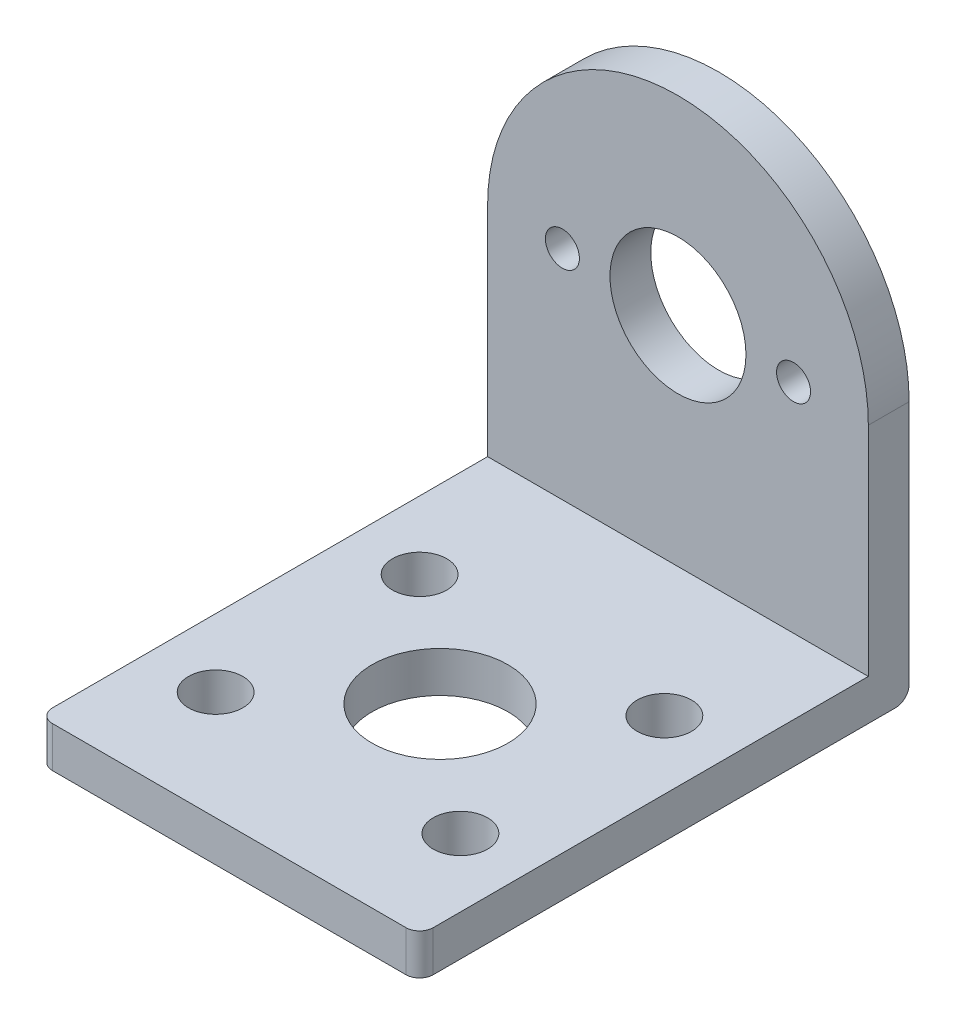
ISO-10303-21;
HEADER;
FILE_DESCRIPTION(('STEP AP214'),'2;1');
FILE_NAME('part.step','',(''),(''),'','','');
FILE_SCHEMA(('AUTOMOTIVE_DESIGN { 1 0 10303 214 1 1 1 1 }'));
ENDSEC;
DATA;
#1=APPLICATION_CONTEXT('core data for automotive mechanical design processes');
#2=APPLICATION_PROTOCOL_DEFINITION('international standard','automotive_design',2000,#1);
#3=PRODUCT_CONTEXT('',#1,'mechanical');
#4=PRODUCT('Part','Part','',(#3));
#5=PRODUCT_RELATED_PRODUCT_CATEGORY('part','',(#4));
#6=PRODUCT_DEFINITION_FORMATION('','',#4);
#7=PRODUCT_DEFINITION_CONTEXT('part definition',#1,'design');
#8=PRODUCT_DEFINITION('design','',#6,#7);
#9=PRODUCT_DEFINITION_SHAPE('','',#8);
#10=(LENGTH_UNIT() NAMED_UNIT(*) SI_UNIT(.MILLI.,.METRE.));
#11=(NAMED_UNIT(*) PLANE_ANGLE_UNIT() SI_UNIT($,.RADIAN.));
#12=(NAMED_UNIT(*) SI_UNIT($,.STERADIAN.) SOLID_ANGLE_UNIT());
#13=UNCERTAINTY_MEASURE_WITH_UNIT(LENGTH_MEASURE(1.E-05),#10,'distance_accuracy_value','');
#14=(GEOMETRIC_REPRESENTATION_CONTEXT(3) GLOBAL_UNCERTAINTY_ASSIGNED_CONTEXT((#13)) GLOBAL_UNIT_ASSIGNED_CONTEXT((#10,
#11,#12)) REPRESENTATION_CONTEXT('',''));
#15=CARTESIAN_POINT('',(0.,0.,0.));
#16=DIRECTION('',(0.,0.,1.));
#17=DIRECTION('',(1.,0.,0.));
#18=AXIS2_PLACEMENT_3D('',#15,#16,#17);
#19=CARTESIAN_POINT('',(0.,0.,3.));
#20=DIRECTION('',(0.,0.,1.));
#21=DIRECTION('',(1.,0.,0.));
#22=AXIS2_PLACEMENT_3D('',#19,#20,#21);
#23=PLANE('',#22);
#24=DIRECTION('',(-1.,0.,0.));
#25=VECTOR('',#24,1.);
#26=CARTESIAN_POINT('',(-14.,-16.,3.));
#27=LINE('',#26,#25);
#28=CARTESIAN_POINT('',(14.,-16.,3.));
#29=VERTEX_POINT('',#28);
#30=CARTESIAN_POINT('',(-14.,-16.,3.));
#31=VERTEX_POINT('',#30);
#32=EDGE_CURVE('E130',#29,#31,#27,.T.);
#33=ORIENTED_EDGE('',*,*,#32,.F.);
#34=DIRECTION('',(0.,1.,0.));
#35=VECTOR('',#34,1.);
#36=CARTESIAN_POINT('',(14.,0.,3.));
#37=LINE('',#36,#35);
#38=CARTESIAN_POINT('',(14.,0.,3.));
#39=VERTEX_POINT('',#38);
#40=EDGE_CURVE('E136',#29,#39,#37,.T.);
#41=ORIENTED_EDGE('',*,*,#40,.T.);
#42=CARTESIAN_POINT('',(0.,0.,3.));
#43=DIRECTION('',(0.,0.,1.));
#44=DIRECTION('',(1.,0.,0.));
#45=AXIS2_PLACEMENT_3D('',#42,#43,#44);
#46=CIRCLE('',#45,14.);
#47=CARTESIAN_POINT('',(-14.,0.,3.));
#48=VERTEX_POINT('',#47);
#49=EDGE_CURVE('E133',#39,#48,#46,.T.);
#50=ORIENTED_EDGE('',*,*,#49,.T.);
#51=DIRECTION('',(0.,-1.,0.));
#52=VECTOR('',#51,1.);
#53=CARTESIAN_POINT('',(-14.,0.,3.));
#54=LINE('',#53,#52);
#55=EDGE_CURVE('E117',#48,#31,#54,.T.);
#56=ORIENTED_EDGE('',*,*,#55,.T.);
#57=EDGE_LOOP('',(#33,#41,#50,#56));
#58=FACE_BOUND('',#57,.T.);
#59=CARTESIAN_POINT('',(-8.5,0.,3.));
#60=DIRECTION('',(0.,0.,1.));
#61=DIRECTION('',(1.,0.,0.));
#62=AXIS2_PLACEMENT_3D('',#59,#60,#61);
#63=CIRCLE('',#62,1.25);
#64=CARTESIAN_POINT('',(-7.25,0.,3.));
#65=VERTEX_POINT('',#64);
#66=EDGE_CURVE('E163',#65,#65,#63,.T.);
#67=ORIENTED_EDGE('',*,*,#66,.F.);
#68=EDGE_LOOP('',(#67));
#69=FACE_BOUND('',#68,.T.);
#70=CARTESIAN_POINT('',(0.,0.,3.));
#71=DIRECTION('',(0.,0.,1.));
#72=DIRECTION('',(1.,0.,0.));
#73=AXIS2_PLACEMENT_3D('',#70,#71,#72);
#74=CIRCLE('',#73,5.);
#75=CARTESIAN_POINT('',(5.,0.,3.));
#76=VERTEX_POINT('',#75);
#77=EDGE_CURVE('E171',#76,#76,#74,.T.);
#78=ORIENTED_EDGE('',*,*,#77,.F.);
#79=EDGE_LOOP('',(#78));
#80=FACE_BOUND('',#79,.T.);
#81=CARTESIAN_POINT('',(8.5,0.,3.));
#82=DIRECTION('',(0.,0.,1.));
#83=DIRECTION('',(1.,0.,0.));
#84=AXIS2_PLACEMENT_3D('',#81,#82,#83);
#85=CIRCLE('',#84,1.25);
#86=CARTESIAN_POINT('',(9.75,0.,3.));
#87=VERTEX_POINT('',#86);
#88=EDGE_CURVE('E155',#87,#87,#85,.T.);
#89=ORIENTED_EDGE('',*,*,#88,.F.);
#90=EDGE_LOOP('',(#89));
#91=FACE_BOUND('',#90,.T.);
#92=ADVANCED_FACE('F41',(#58,#69,#80,#91),#23,.T.);
#93=CARTESIAN_POINT('',(0.,0.,0.));
#94=DIRECTION('',(0.,0.,1.));
#95=DIRECTION('',(1.,0.,0.));
#96=AXIS2_PLACEMENT_3D('',#93,#94,#95);
#97=PLANE('',#96);
#98=DIRECTION('',(0.,1.,0.));
#99=VECTOR('',#98,1.);
#100=CARTESIAN_POINT('',(14.,0.,0.));
#101=LINE('',#100,#99);
#102=CARTESIAN_POINT('',(14.,-18.,0.));
#103=VERTEX_POINT('',#102);
#104=CARTESIAN_POINT('',(14.,0.,0.));
#105=VERTEX_POINT('',#104);
#106=EDGE_CURVE('E180',#103,#105,#101,.T.);
#107=ORIENTED_EDGE('',*,*,#106,.F.);
#108=DIRECTION('',(1.,0.,0.));
#109=VECTOR('',#108,1.);
#110=CARTESIAN_POINT('',(0.,-18.,0.));
#111=LINE('',#110,#109);
#112=CARTESIAN_POINT('',(-14.,-18.,0.));
#113=VERTEX_POINT('',#112);
#114=EDGE_CURVE('E11',#103,#113,#111,.F.);
#115=ORIENTED_EDGE('',*,*,#114,.T.);
#116=DIRECTION('',(0.,-1.,0.));
#117=VECTOR('',#116,1.);
#118=CARTESIAN_POINT('',(-14.,0.,0.));
#119=LINE('',#118,#117);
#120=CARTESIAN_POINT('',(-14.,0.,0.));
#121=VERTEX_POINT('',#120);
#122=EDGE_CURVE('E188',#121,#113,#119,.T.);
#123=ORIENTED_EDGE('',*,*,#122,.F.);
#124=CARTESIAN_POINT('',(0.,0.,0.));
#125=DIRECTION('',(0.,0.,1.));
#126=DIRECTION('',(1.,0.,0.));
#127=AXIS2_PLACEMENT_3D('',#124,#125,#126);
#128=CIRCLE('',#127,14.);
#129=EDGE_CURVE('E175',#105,#121,#128,.T.);
#130=ORIENTED_EDGE('',*,*,#129,.F.);
#131=EDGE_LOOP('',(#107,#115,#123,#130));
#132=FACE_BOUND('',#131,.T.);
#133=CARTESIAN_POINT('',(0.,0.,0.));
#134=DIRECTION('',(0.,0.,1.));
#135=DIRECTION('',(1.,0.,0.));
#136=AXIS2_PLACEMENT_3D('',#133,#134,#135);
#137=CIRCLE('',#136,5.);
#138=CARTESIAN_POINT('',(5.,0.,0.));
#139=VERTEX_POINT('',#138);
#140=EDGE_CURVE('E167',#139,#139,#137,.T.);
#141=ORIENTED_EDGE('',*,*,#140,.T.);
#142=EDGE_LOOP('',(#141));
#143=FACE_BOUND('',#142,.T.);
#144=CARTESIAN_POINT('',(-8.5,0.,0.));
#145=DIRECTION('',(0.,0.,1.));
#146=DIRECTION('',(1.,0.,0.));
#147=AXIS2_PLACEMENT_3D('',#144,#145,#146);
#148=CIRCLE('',#147,1.25);
#149=CARTESIAN_POINT('',(-7.25,0.,0.));
#150=VERTEX_POINT('',#149);
#151=EDGE_CURVE('E159',#150,#150,#148,.T.);
#152=ORIENTED_EDGE('',*,*,#151,.T.);
#153=EDGE_LOOP('',(#152));
#154=FACE_BOUND('',#153,.T.);
#155=CARTESIAN_POINT('',(8.5,0.,0.));
#156=DIRECTION('',(0.,0.,1.));
#157=DIRECTION('',(1.,0.,0.));
#158=AXIS2_PLACEMENT_3D('',#155,#156,#157);
#159=CIRCLE('',#158,1.25);
#160=CARTESIAN_POINT('',(9.75,0.,0.));
#161=VERTEX_POINT('',#160);
#162=EDGE_CURVE('E154',#161,#161,#159,.T.);
#163=ORIENTED_EDGE('',*,*,#162,.T.);
#164=EDGE_LOOP('',(#163));
#165=FACE_BOUND('',#164,.T.);
#166=ADVANCED_FACE('F276',(#132,#143,#154,#165),#97,.F.);
#167=CARTESIAN_POINT('',(0.,0.,3.));
#168=DIRECTION('',(0.,0.,-1.));
#169=DIRECTION('',(-1.,0.,0.));
#170=AXIS2_PLACEMENT_3D('',#167,#168,#169);
#171=CYLINDRICAL_SURFACE('',#170,14.);
#172=ORIENTED_EDGE('',*,*,#129,.T.);
#173=DIRECTION('',(0.,0.,-1.));
#174=VECTOR('',#173,1.);
#175=CARTESIAN_POINT('',(-14.,0.,3.));
#176=LINE('',#175,#174);
#177=EDGE_CURVE('E203',#48,#121,#176,.T.);
#178=ORIENTED_EDGE('',*,*,#177,.F.);
#179=ORIENTED_EDGE('',*,*,#49,.F.);
#180=DIRECTION('',(0.,0.,-1.));
#181=VECTOR('',#180,1.);
#182=CARTESIAN_POINT('',(14.,0.,3.));
#183=LINE('',#182,#181);
#184=EDGE_CURVE('E184',#39,#105,#183,.T.);
#185=ORIENTED_EDGE('',*,*,#184,.T.);
#186=EDGE_LOOP('',(#172,#178,#179,#185));
#187=FACE_BOUND('',#186,.T.);
#188=ADVANCED_FACE('F281',(#187),#171,.T.);
#189=CARTESIAN_POINT('',(-14.,0.,3.));
#190=DIRECTION('',(1.,0.,0.));
#191=DIRECTION('',(0.,0.,-1.));
#192=AXIS2_PLACEMENT_3D('',#189,#190,#191);
#193=PLANE('',#192);
#194=DIRECTION('',(0.,0.,-1.));
#195=VECTOR('',#194,1.);
#196=CARTESIAN_POINT('',(-14.,-19.,3.));
#197=LINE('',#196,#195);
#198=CARTESIAN_POINT('',(-14.,-19.,35.));
#199=VERTEX_POINT('',#198);
#200=CARTESIAN_POINT('',(-14.,-19.,1.));
#201=VERTEX_POINT('',#200);
#202=EDGE_CURVE('E200',#199,#201,#197,.T.);
#203=ORIENTED_EDGE('',*,*,#202,.F.);
#204=DIRECTION('',(0.,-1.,0.));
#205=VECTOR('',#204,1.);
#206=CARTESIAN_POINT('',(-14.,0.,35.));
#207=LINE('',#206,#205);
#208=CARTESIAN_POINT('',(-14.,-16.,35.));
#209=VERTEX_POINT('',#208);
#210=EDGE_CURVE('E51',#199,#209,#207,.F.);
#211=ORIENTED_EDGE('',*,*,#210,.T.);
#212=DIRECTION('',(0.,0.,-1.));
#213=VECTOR('',#212,1.);
#214=CARTESIAN_POINT('',(-14.,-16.,36.));
#215=LINE('',#214,#213);
#216=EDGE_CURVE('E113',#209,#31,#215,.T.);
#217=ORIENTED_EDGE('',*,*,#216,.T.);
#218=ORIENTED_EDGE('',*,*,#55,.F.);
#219=ORIENTED_EDGE('',*,*,#177,.T.);
#220=ORIENTED_EDGE('',*,*,#122,.T.);
#221=CARTESIAN_POINT('',(-14.,-18.,1.));
#222=DIRECTION('',(1.,0.,0.));
#223=DIRECTION('',(0.,0.,-1.));
#224=AXIS2_PLACEMENT_3D('',#221,#222,#223);
#225=CIRCLE('',#224,1.);
#226=EDGE_CURVE('E64',#113,#201,#225,.F.);
#227=ORIENTED_EDGE('',*,*,#226,.T.);
#228=EDGE_LOOP('',(#203,#211,#217,#218,#219,#220,#227));
#229=FACE_BOUND('',#228,.T.);
#230=ADVANCED_FACE('F115',(#229),#193,.F.);
#231=CARTESIAN_POINT('',(14.,-19.,3.));
#232=DIRECTION('',(0.,1.,0.));
#233=DIRECTION('',(0.,0.,1.));
#234=AXIS2_PLACEMENT_3D('',#231,#232,#233);
#235=PLANE('',#234);
#236=CARTESIAN_POINT('',(-9.,-19.,13.));
#237=DIRECTION('',(0.,-1.,0.));
#238=DIRECTION('',(0.,0.,-1.));
#239=AXIS2_PLACEMENT_3D('',#236,#237,#238);
#240=CIRCLE('',#239,2.);
#241=CARTESIAN_POINT('',(-9.,-19.,11.));
#242=VERTEX_POINT('',#241);
#243=EDGE_CURVE('E360',#242,#242,#240,.T.);
#244=ORIENTED_EDGE('',*,*,#243,.F.);
#245=EDGE_LOOP('',(#244));
#246=FACE_BOUND('',#245,.T.);
#247=CARTESIAN_POINT('',(9.,-19.,28.));
#248=DIRECTION('',(0.,-1.,0.));
#249=DIRECTION('',(0.,0.,-1.));
#250=AXIS2_PLACEMENT_3D('',#247,#248,#249);
#251=CIRCLE('',#250,2.);
#252=CARTESIAN_POINT('',(9.,-19.,26.));
#253=VERTEX_POINT('',#252);
#254=EDGE_CURVE('E364',#253,#253,#251,.T.);
#255=ORIENTED_EDGE('',*,*,#254,.F.);
#256=EDGE_LOOP('',(#255));
#257=FACE_BOUND('',#256,.T.);
#258=CARTESIAN_POINT('',(9.,-19.,13.));
#259=DIRECTION('',(0.,-1.,0.));
#260=DIRECTION('',(0.,0.,-1.));
#261=AXIS2_PLACEMENT_3D('',#258,#259,#260);
#262=CIRCLE('',#261,2.);
#263=CARTESIAN_POINT('',(9.,-19.,11.));
#264=VERTEX_POINT('',#263);
#265=EDGE_CURVE('E368',#264,#264,#262,.T.);
#266=ORIENTED_EDGE('',*,*,#265,.F.);
#267=EDGE_LOOP('',(#266));
#268=FACE_BOUND('',#267,.T.);
#269=CARTESIAN_POINT('',(0.,-19.,20.5));
#270=DIRECTION('',(0.,-1.,0.));
#271=DIRECTION('',(0.,0.,-1.));
#272=AXIS2_PLACEMENT_3D('',#269,#270,#271);
#273=CIRCLE('',#272,5.);
#274=CARTESIAN_POINT('',(0.,-19.,15.5));
#275=VERTEX_POINT('',#274);
#276=EDGE_CURVE('E370',#275,#275,#273,.T.);
#277=ORIENTED_EDGE('',*,*,#276,.F.);
#278=EDGE_LOOP('',(#277));
#279=FACE_BOUND('',#278,.T.);
#280=CARTESIAN_POINT('',(-9.,-19.,28.));
#281=DIRECTION('',(0.,-1.,0.));
#282=DIRECTION('',(0.,0.,-1.));
#283=AXIS2_PLACEMENT_3D('',#280,#281,#282);
#284=CIRCLE('',#283,2.);
#285=CARTESIAN_POINT('',(-9.,-19.,26.));
#286=VERTEX_POINT('',#285);
#287=EDGE_CURVE('E245',#286,#286,#284,.T.);
#288=ORIENTED_EDGE('',*,*,#287,.F.);
#289=EDGE_LOOP('',(#288));
#290=FACE_BOUND('',#289,.T.);
#291=DIRECTION('',(0.,0.,-1.));
#292=VECTOR('',#291,1.);
#293=CARTESIAN_POINT('',(14.,-19.,3.));
#294=LINE('',#293,#292);
#295=CARTESIAN_POINT('',(14.,-19.,35.));
#296=VERTEX_POINT('',#295);
#297=CARTESIAN_POINT('',(14.,-19.,1.));
#298=VERTEX_POINT('',#297);
#299=EDGE_CURVE('E196',#296,#298,#294,.T.);
#300=ORIENTED_EDGE('',*,*,#299,.F.);
#301=CARTESIAN_POINT('',(13.,-19.,35.));
#302=DIRECTION('',(0.,1.,0.));
#303=DIRECTION('',(0.,0.,1.));
#304=AXIS2_PLACEMENT_3D('',#301,#302,#303);
#305=CIRCLE('',#304,1.);
#306=CARTESIAN_POINT('',(13.,-19.,36.));
#307=VERTEX_POINT('',#306);
#308=EDGE_CURVE('E233',#296,#307,#305,.F.);
#309=ORIENTED_EDGE('',*,*,#308,.T.);
#310=DIRECTION('',(1.,0.,0.));
#311=VECTOR('',#310,1.);
#312=CARTESIAN_POINT('',(-14.,-19.,36.));
#313=LINE('',#312,#311);
#314=CARTESIAN_POINT('',(-13.,-19.,36.));
#315=VERTEX_POINT('',#314);
#316=EDGE_CURVE('E142',#315,#307,#313,.T.);
#317=ORIENTED_EDGE('',*,*,#316,.F.);
#318=CARTESIAN_POINT('',(-13.,-19.,35.));
#319=DIRECTION('',(0.,1.,0.));
#320=DIRECTION('',(0.,0.,1.));
#321=AXIS2_PLACEMENT_3D('',#318,#319,#320);
#322=CIRCLE('',#321,1.);
#323=EDGE_CURVE('E230',#315,#199,#322,.F.);
#324=ORIENTED_EDGE('',*,*,#323,.T.);
#325=ORIENTED_EDGE('',*,*,#202,.T.);
#326=DIRECTION('',(1.,0.,0.));
#327=VECTOR('',#326,1.);
#328=CARTESIAN_POINT('',(14.,-19.,1.));
#329=LINE('',#328,#327);
#330=EDGE_CURVE('E226',#201,#298,#329,.T.);
#331=ORIENTED_EDGE('',*,*,#330,.T.);
#332=EDGE_LOOP('',(#300,#309,#317,#324,#325,#331));
#333=FACE_BOUND('',#332,.T.);
#334=ADVANCED_FACE('F290',(#246,#257,#268,#279,#290,#333),#235,.F.);
#335=CARTESIAN_POINT('',(14.,0.,3.));
#336=DIRECTION('',(-1.,0.,0.));
#337=DIRECTION('',(0.,0.,1.));
#338=AXIS2_PLACEMENT_3D('',#335,#336,#337);
#339=PLANE('',#338);
#340=DIRECTION('',(0.,0.,-1.));
#341=VECTOR('',#340,1.);
#342=CARTESIAN_POINT('',(14.,-16.,36.));
#343=LINE('',#342,#341);
#344=CARTESIAN_POINT('',(14.,-16.,35.));
#345=VERTEX_POINT('',#344);
#346=EDGE_CURVE('E124',#345,#29,#343,.T.);
#347=ORIENTED_EDGE('',*,*,#346,.F.);
#348=DIRECTION('',(0.,1.,0.));
#349=VECTOR('',#348,1.);
#350=CARTESIAN_POINT('',(14.,0.,35.));
#351=LINE('',#350,#349);
#352=EDGE_CURVE('E223',#345,#296,#351,.F.);
#353=ORIENTED_EDGE('',*,*,#352,.T.);
#354=ORIENTED_EDGE('',*,*,#299,.T.);
#355=CARTESIAN_POINT('',(14.,-18.,1.));
#356=DIRECTION('',(-1.,0.,0.));
#357=DIRECTION('',(0.,0.,1.));
#358=AXIS2_PLACEMENT_3D('',#355,#356,#357);
#359=CIRCLE('',#358,1.);
#360=EDGE_CURVE('E220',#298,#103,#359,.F.);
#361=ORIENTED_EDGE('',*,*,#360,.T.);
#362=ORIENTED_EDGE('',*,*,#106,.T.);
#363=ORIENTED_EDGE('',*,*,#184,.F.);
#364=ORIENTED_EDGE('',*,*,#40,.F.);
#365=EDGE_LOOP('',(#347,#353,#354,#361,#362,#363,#364));
#366=FACE_BOUND('',#365,.T.);
#367=ADVANCED_FACE('F287',(#366),#339,.F.);
#368=CARTESIAN_POINT('',(0.,0.,3.));
#369=DIRECTION('',(0.,0.,-1.));
#370=DIRECTION('',(-1.,0.,0.));
#371=AXIS2_PLACEMENT_3D('',#368,#369,#370);
#372=CYLINDRICAL_SURFACE('',#371,5.);
#373=ORIENTED_EDGE('',*,*,#77,.T.);
#374=EDGE_LOOP('',(#373));
#375=FACE_BOUND('',#374,.T.);
#376=ORIENTED_EDGE('',*,*,#140,.F.);
#377=EDGE_LOOP('',(#376));
#378=FACE_BOUND('',#377,.T.);
#379=ADVANCED_FACE('F284',(#375,#378),#372,.F.);
#380=CARTESIAN_POINT('',(-8.5,0.,3.));
#381=DIRECTION('',(0.,0.,-1.));
#382=DIRECTION('',(-1.,0.,0.));
#383=AXIS2_PLACEMENT_3D('',#380,#381,#382);
#384=CYLINDRICAL_SURFACE('',#383,1.25);
#385=ORIENTED_EDGE('',*,*,#66,.T.);
#386=EDGE_LOOP('',(#385));
#387=FACE_BOUND('',#386,.T.);
#388=ORIENTED_EDGE('',*,*,#151,.F.);
#389=EDGE_LOOP('',(#388));
#390=FACE_BOUND('',#389,.T.);
#391=ADVANCED_FACE('F334',(#387,#390),#384,.F.);
#392=CARTESIAN_POINT('',(8.5,0.,3.));
#393=DIRECTION('',(0.,0.,-1.));
#394=DIRECTION('',(-1.,0.,0.));
#395=AXIS2_PLACEMENT_3D('',#392,#393,#394);
#396=CYLINDRICAL_SURFACE('',#395,1.25);
#397=ORIENTED_EDGE('',*,*,#88,.T.);
#398=EDGE_LOOP('',(#397));
#399=FACE_BOUND('',#398,.T.);
#400=ORIENTED_EDGE('',*,*,#162,.F.);
#401=EDGE_LOOP('',(#400));
#402=FACE_BOUND('',#401,.T.);
#403=ADVANCED_FACE('F332',(#399,#402),#396,.F.);
#404=CARTESIAN_POINT('',(-14.,-16.,36.));
#405=DIRECTION('',(0.,-1.,0.));
#406=DIRECTION('',(0.,0.,-1.));
#407=AXIS2_PLACEMENT_3D('',#404,#405,#406);
#408=PLANE('',#407);
#409=CARTESIAN_POINT('',(-9.,-16.,13.));
#410=DIRECTION('',(0.,-1.,0.));
#411=DIRECTION('',(0.,0.,-1.));
#412=AXIS2_PLACEMENT_3D('',#409,#410,#411);
#413=CIRCLE('',#412,2.);
#414=CARTESIAN_POINT('',(-9.,-16.,11.));
#415=VERTEX_POINT('',#414);
#416=EDGE_CURVE('E45',#415,#415,#413,.T.);
#417=ORIENTED_EDGE('',*,*,#416,.T.);
#418=EDGE_LOOP('',(#417));
#419=FACE_BOUND('',#418,.T.);
#420=CARTESIAN_POINT('',(9.,-16.,28.));
#421=DIRECTION('',(0.,-1.,0.));
#422=DIRECTION('',(0.,0.,-1.));
#423=AXIS2_PLACEMENT_3D('',#420,#421,#422);
#424=CIRCLE('',#423,2.);
#425=CARTESIAN_POINT('',(9.,-16.,26.));
#426=VERTEX_POINT('',#425);
#427=EDGE_CURVE('E149',#426,#426,#424,.T.);
#428=ORIENTED_EDGE('',*,*,#427,.T.);
#429=EDGE_LOOP('',(#428));
#430=FACE_BOUND('',#429,.T.);
#431=CARTESIAN_POINT('',(9.,-16.,13.));
#432=DIRECTION('',(0.,-1.,0.));
#433=DIRECTION('',(0.,0.,-1.));
#434=AXIS2_PLACEMENT_3D('',#431,#432,#433);
#435=CIRCLE('',#434,2.);
#436=CARTESIAN_POINT('',(9.,-16.,11.));
#437=VERTEX_POINT('',#436);
#438=EDGE_CURVE('E249',#437,#437,#435,.T.);
#439=ORIENTED_EDGE('',*,*,#438,.T.);
#440=EDGE_LOOP('',(#439));
#441=FACE_BOUND('',#440,.T.);
#442=CARTESIAN_POINT('',(0.,-16.,20.5));
#443=DIRECTION('',(0.,-1.,0.));
#444=DIRECTION('',(0.,0.,-1.));
#445=AXIS2_PLACEMENT_3D('',#442,#443,#444);
#446=CIRCLE('',#445,5.);
#447=CARTESIAN_POINT('',(0.,-16.,15.5));
#448=VERTEX_POINT('',#447);
#449=EDGE_CURVE('E244',#448,#448,#446,.T.);
#450=ORIENTED_EDGE('',*,*,#449,.T.);
#451=EDGE_LOOP('',(#450));
#452=FACE_BOUND('',#451,.T.);
#453=CARTESIAN_POINT('',(-9.,-16.,28.));
#454=DIRECTION('',(0.,-1.,0.));
#455=DIRECTION('',(0.,0.,-1.));
#456=AXIS2_PLACEMENT_3D('',#453,#454,#455);
#457=CIRCLE('',#456,2.);
#458=CARTESIAN_POINT('',(-9.,-16.,26.));
#459=VERTEX_POINT('',#458);
#460=EDGE_CURVE('E240',#459,#459,#457,.T.);
#461=ORIENTED_EDGE('',*,*,#460,.T.);
#462=EDGE_LOOP('',(#461));
#463=FACE_BOUND('',#462,.T.);
#464=DIRECTION('',(-1.,0.,0.));
#465=VECTOR('',#464,1.);
#466=CARTESIAN_POINT('',(-14.,-16.,36.));
#467=LINE('',#466,#465);
#468=CARTESIAN_POINT('',(13.,-16.,36.));
#469=VERTEX_POINT('',#468);
#470=CARTESIAN_POINT('',(-13.,-16.,36.));
#471=VERTEX_POINT('',#470);
#472=EDGE_CURVE('E125',#469,#471,#467,.T.);
#473=ORIENTED_EDGE('',*,*,#472,.F.);
#474=CARTESIAN_POINT('',(13.,-16.,35.));
#475=DIRECTION('',(0.,-1.,0.));
#476=DIRECTION('',(0.,0.,-1.));
#477=AXIS2_PLACEMENT_3D('',#474,#475,#476);
#478=CIRCLE('',#477,1.);
#479=EDGE_CURVE('E217',#469,#345,#478,.F.);
#480=ORIENTED_EDGE('',*,*,#479,.T.);
#481=ORIENTED_EDGE('',*,*,#346,.T.);
#482=ORIENTED_EDGE('',*,*,#32,.T.);
#483=ORIENTED_EDGE('',*,*,#216,.F.);
#484=CARTESIAN_POINT('',(-13.,-16.,35.));
#485=DIRECTION('',(0.,-1.,0.));
#486=DIRECTION('',(0.,0.,-1.));
#487=AXIS2_PLACEMENT_3D('',#484,#485,#486);
#488=CIRCLE('',#487,1.);
#489=EDGE_CURVE('E214',#209,#471,#488,.F.);
#490=ORIENTED_EDGE('',*,*,#489,.T.);
#491=EDGE_LOOP('',(#473,#480,#481,#482,#483,#490));
#492=FACE_BOUND('',#491,.T.);
#493=ADVANCED_FACE('F139',(#419,#430,#441,#452,#463,#492),#408,.F.);
#494=CARTESIAN_POINT('',(0.,0.,36.));
#495=DIRECTION('',(0.,0.,-1.));
#496=DIRECTION('',(-1.,0.,0.));
#497=AXIS2_PLACEMENT_3D('',#494,#495,#496);
#498=PLANE('',#497);
#499=ORIENTED_EDGE('',*,*,#316,.T.);
#500=DIRECTION('',(0.,1.,0.));
#501=VECTOR('',#500,1.);
#502=CARTESIAN_POINT('',(13.,0.,36.));
#503=LINE('',#502,#501);
#504=EDGE_CURVE('E210',#307,#469,#503,.T.);
#505=ORIENTED_EDGE('',*,*,#504,.T.);
#506=ORIENTED_EDGE('',*,*,#472,.T.);
#507=DIRECTION('',(0.,-1.,0.));
#508=VECTOR('',#507,1.);
#509=CARTESIAN_POINT('',(-13.,0.,36.));
#510=LINE('',#509,#508);
#511=EDGE_CURVE('E206',#471,#315,#510,.T.);
#512=ORIENTED_EDGE('',*,*,#511,.T.);
#513=EDGE_LOOP('',(#499,#505,#506,#512));
#514=FACE_BOUND('',#513,.T.);
#515=ADVANCED_FACE('F303',(#514),#498,.F.);
#516=CARTESIAN_POINT('',(13.,0.,35.));
#517=DIRECTION('',(0.,1.,0.));
#518=DIRECTION('',(0.,0.,1.));
#519=AXIS2_PLACEMENT_3D('',#516,#517,#518);
#520=CYLINDRICAL_SURFACE('',#519,1.);
#521=ORIENTED_EDGE('',*,*,#308,.F.);
#522=ORIENTED_EDGE('',*,*,#352,.F.);
#523=ORIENTED_EDGE('',*,*,#479,.F.);
#524=ORIENTED_EDGE('',*,*,#504,.F.);
#525=EDGE_LOOP('',(#521,#522,#523,#524));
#526=FACE_BOUND('',#525,.T.);
#527=ADVANCED_FACE('F300',(#526),#520,.T.);
#528=CARTESIAN_POINT('',(-13.,0.,35.));
#529=DIRECTION('',(0.,-1.,0.));
#530=DIRECTION('',(0.,0.,-1.));
#531=AXIS2_PLACEMENT_3D('',#528,#529,#530);
#532=CYLINDRICAL_SURFACE('',#531,1.);
#533=ORIENTED_EDGE('',*,*,#489,.F.);
#534=ORIENTED_EDGE('',*,*,#210,.F.);
#535=ORIENTED_EDGE('',*,*,#323,.F.);
#536=ORIENTED_EDGE('',*,*,#511,.F.);
#537=EDGE_LOOP('',(#533,#534,#535,#536));
#538=FACE_BOUND('',#537,.T.);
#539=ADVANCED_FACE('F302',(#538),#532,.T.);
#540=CARTESIAN_POINT('',(14.,-18.,1.));
#541=DIRECTION('',(1.,0.,0.));
#542=DIRECTION('',(0.,0.,-1.));
#543=AXIS2_PLACEMENT_3D('',#540,#541,#542);
#544=CYLINDRICAL_SURFACE('',#543,1.);
#545=ORIENTED_EDGE('',*,*,#226,.F.);
#546=ORIENTED_EDGE('',*,*,#114,.F.);
#547=ORIENTED_EDGE('',*,*,#360,.F.);
#548=ORIENTED_EDGE('',*,*,#330,.F.);
#549=EDGE_LOOP('',(#545,#546,#547,#548));
#550=FACE_BOUND('',#549,.T.);
#551=ADVANCED_FACE('F43',(#550),#544,.T.);
#552=CARTESIAN_POINT('',(-9.,-9.,28.));
#553=DIRECTION('',(0.,-1.,0.));
#554=DIRECTION('',(0.,0.,-1.));
#555=AXIS2_PLACEMENT_3D('',#552,#553,#554);
#556=CYLINDRICAL_SURFACE('',#555,2.);
#557=ORIENTED_EDGE('',*,*,#287,.T.);
#558=EDGE_LOOP('',(#557));
#559=FACE_BOUND('',#558,.T.);
#560=ORIENTED_EDGE('',*,*,#460,.F.);
#561=EDGE_LOOP('',(#560));
#562=FACE_BOUND('',#561,.T.);
#563=ADVANCED_FACE('F310',(#559,#562),#556,.F.);
#564=CARTESIAN_POINT('',(0.,-9.,20.5));
#565=DIRECTION('',(0.,-1.,0.));
#566=DIRECTION('',(0.,0.,-1.));
#567=AXIS2_PLACEMENT_3D('',#564,#565,#566);
#568=CYLINDRICAL_SURFACE('',#567,5.);
#569=ORIENTED_EDGE('',*,*,#276,.T.);
#570=EDGE_LOOP('',(#569));
#571=FACE_BOUND('',#570,.T.);
#572=ORIENTED_EDGE('',*,*,#449,.F.);
#573=EDGE_LOOP('',(#572));
#574=FACE_BOUND('',#573,.T.);
#575=ADVANCED_FACE('F270',(#571,#574),#568,.F.);
#576=CARTESIAN_POINT('',(9.,-9.,13.));
#577=DIRECTION('',(0.,-1.,0.));
#578=DIRECTION('',(0.,0.,-1.));
#579=AXIS2_PLACEMENT_3D('',#576,#577,#578);
#580=CYLINDRICAL_SURFACE('',#579,2.);
#581=ORIENTED_EDGE('',*,*,#265,.T.);
#582=EDGE_LOOP('',(#581));
#583=FACE_BOUND('',#582,.T.);
#584=ORIENTED_EDGE('',*,*,#438,.F.);
#585=EDGE_LOOP('',(#584));
#586=FACE_BOUND('',#585,.T.);
#587=ADVANCED_FACE('F261',(#583,#586),#580,.F.);
#588=CARTESIAN_POINT('',(9.,-9.,28.));
#589=DIRECTION('',(0.,-1.,0.));
#590=DIRECTION('',(0.,0.,-1.));
#591=AXIS2_PLACEMENT_3D('',#588,#589,#590);
#592=CYLINDRICAL_SURFACE('',#591,2.);
#593=ORIENTED_EDGE('',*,*,#254,.T.);
#594=EDGE_LOOP('',(#593));
#595=FACE_BOUND('',#594,.T.);
#596=ORIENTED_EDGE('',*,*,#427,.F.);
#597=EDGE_LOOP('',(#596));
#598=FACE_BOUND('',#597,.T.);
#599=ADVANCED_FACE('F258',(#595,#598),#592,.F.);
#600=CARTESIAN_POINT('',(-9.,-9.,13.));
#601=DIRECTION('',(0.,-1.,0.));
#602=DIRECTION('',(0.,0.,-1.));
#603=AXIS2_PLACEMENT_3D('',#600,#601,#602);
#604=CYLINDRICAL_SURFACE('',#603,2.);
#605=ORIENTED_EDGE('',*,*,#243,.T.);
#606=EDGE_LOOP('',(#605));
#607=FACE_BOUND('',#606,.T.);
#608=ORIENTED_EDGE('',*,*,#416,.F.);
#609=EDGE_LOOP('',(#608));
#610=FACE_BOUND('',#609,.T.);
#611=ADVANCED_FACE('F260',(#607,#610),#604,.F.);
#612=CLOSED_SHELL('',(#92,#166,#188,#230,#334,#367,#379,#391,#403,#493,#515,#527,#539,#551,#563,
#575,#587,#599,#611));
#613=MANIFOLD_SOLID_BREP('B2',#612);
#614=ADVANCED_BREP_SHAPE_REPRESENTATION('',(#18,#613),#14);
#615=SHAPE_DEFINITION_REPRESENTATION(#9,#614);
ENDSEC;
END-ISO-10303-21;
